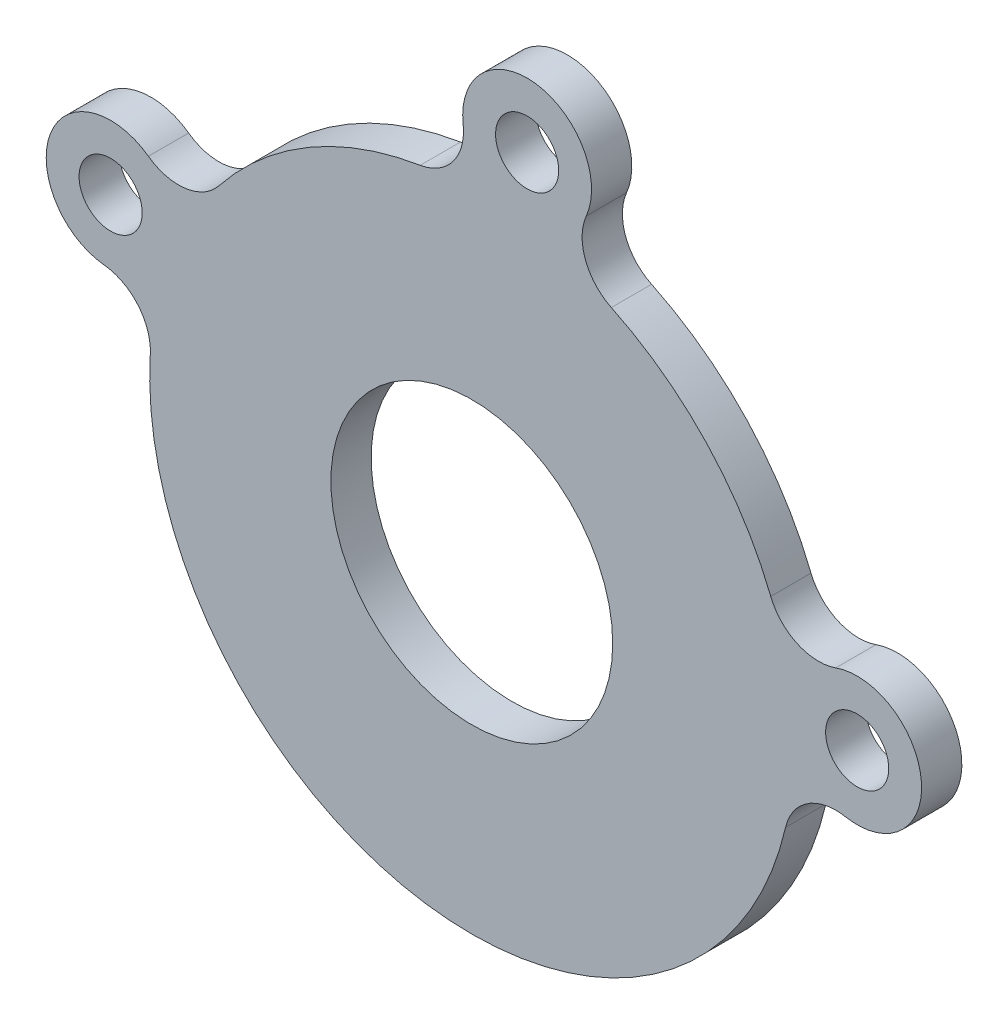
ISO-10303-21;
HEADER;
FILE_DESCRIPTION(('STEP AP214'),'2;1');
FILE_NAME('part.step','',(''),(''),'','','');
FILE_SCHEMA(('AUTOMOTIVE_DESIGN { 1 0 10303 214 1 1 1 1 }'));
ENDSEC;
DATA;
#1=APPLICATION_CONTEXT('core data for automotive mechanical design processes');
#2=APPLICATION_PROTOCOL_DEFINITION('international standard','automotive_design',2000,#1);
#3=PRODUCT_CONTEXT('',#1,'mechanical');
#4=PRODUCT('Part','Part','',(#3));
#5=PRODUCT_RELATED_PRODUCT_CATEGORY('part','',(#4));
#6=PRODUCT_DEFINITION_FORMATION('','',#4);
#7=PRODUCT_DEFINITION_CONTEXT('part definition',#1,'design');
#8=PRODUCT_DEFINITION('design','',#6,#7);
#9=PRODUCT_DEFINITION_SHAPE('','',#8);
#10=(LENGTH_UNIT() NAMED_UNIT(*) SI_UNIT(.MILLI.,.METRE.));
#11=(NAMED_UNIT(*) PLANE_ANGLE_UNIT() SI_UNIT($,.RADIAN.));
#12=(NAMED_UNIT(*) SI_UNIT($,.STERADIAN.) SOLID_ANGLE_UNIT());
#13=UNCERTAINTY_MEASURE_WITH_UNIT(LENGTH_MEASURE(1.E-05),#10,'distance_accuracy_value','');
#14=(GEOMETRIC_REPRESENTATION_CONTEXT(3) GLOBAL_UNCERTAINTY_ASSIGNED_CONTEXT((#13)) GLOBAL_UNIT_ASSIGNED_CONTEXT((#10,
#11,#12)) REPRESENTATION_CONTEXT('',''));
#15=CARTESIAN_POINT('',(0.,0.,0.));
#16=DIRECTION('',(0.,0.,1.));
#17=DIRECTION('',(1.,0.,0.));
#18=AXIS2_PLACEMENT_3D('',#15,#16,#17);
#19=CARTESIAN_POINT('',(245.745886312281,216.215828919142,3.175));
#20=DIRECTION('',(0.,0.,-1.));
#21=DIRECTION('',(-1.,0.,0.));
#22=AXIS2_PLACEMENT_3D('',#19,#20,#21);
#23=CYLINDRICAL_SURFACE('',#22,25.4);
#24=CARTESIAN_POINT('',(245.745886312281,216.215828919142,0.));
#25=DIRECTION('',(0.,0.,1.));
#26=DIRECTION('',(1.,0.,0.));
#27=AXIS2_PLACEMENT_3D('',#24,#25,#26);
#28=CIRCLE('',#27,25.4);
#29=CARTESIAN_POINT('',(269.321400878239,225.668612263232,0.));
#30=VERTEX_POINT('',#29);
#31=CARTESIAN_POINT('',(256.74888847989,239.108927077749,0.));
#32=VERTEX_POINT('',#31);
#33=EDGE_CURVE('E175',#30,#32,#28,.T.);
#34=ORIENTED_EDGE('',*,*,#33,.T.);
#35=DIRECTION('',(0.,0.,-1.));
#36=VECTOR('',#35,1.);
#37=CARTESIAN_POINT('',(256.74888847989,239.108927077749,3.175));
#38=LINE('',#37,#36);
#39=CARTESIAN_POINT('',(256.74888847989,239.108927077749,3.175));
#40=VERTEX_POINT('',#39);
#41=EDGE_CURVE('E11',#40,#32,#38,.T.);
#42=ORIENTED_EDGE('',*,*,#41,.F.);
#43=CARTESIAN_POINT('',(245.745886312281,216.215828919142,3.175));
#44=DIRECTION('',(0.,0.,1.));
#45=DIRECTION('',(1.,0.,0.));
#46=AXIS2_PLACEMENT_3D('',#43,#44,#45);
#47=CIRCLE('',#46,25.4);
#48=CARTESIAN_POINT('',(269.321400878239,225.668612263232,3.175));
#49=VERTEX_POINT('',#48);
#50=EDGE_CURVE('E157',#49,#40,#47,.T.);
#51=ORIENTED_EDGE('',*,*,#50,.F.);
#52=DIRECTION('',(0.,0.,-1.));
#53=VECTOR('',#52,1.);
#54=CARTESIAN_POINT('',(269.321400878239,225.668612263232,3.175));
#55=LINE('',#54,#53);
#56=EDGE_CURVE('E171',#49,#30,#55,.T.);
#57=ORIENTED_EDGE('',*,*,#56,.T.);
#58=EDGE_LOOP('',(#34,#42,#51,#57));
#59=FACE_BOUND('',#58,.T.);
#60=ADVANCED_FACE('F37',(#59),#23,.T.);
#61=CARTESIAN_POINT('',(258.509368826707,242.771822783126,3.175));
#62=DIRECTION('',(0.,0.,-1.));
#63=DIRECTION('',(-1.,0.,0.));
#64=AXIS2_PLACEMENT_3D('',#61,#62,#63);
#65=CYLINDRICAL_SURFACE('',#64,4.06400000000001);
#66=CARTESIAN_POINT('',(258.509368826707,242.771822783126,0.));
#67=DIRECTION('',(0.,0.,1.));
#68=DIRECTION('',(1.,0.,0.));
#69=AXIS2_PLACEMENT_3D('',#66,#67,#68);
#70=CIRCLE('',#69,4.06400000000001);
#71=CARTESIAN_POINT('',(254.775531188719,244.376363992674,0.));
#72=VERTEX_POINT('',#71);
#73=EDGE_CURVE('E178',#32,#72,#70,.F.);
#74=ORIENTED_EDGE('',*,*,#73,.T.);
#75=DIRECTION('',(0.,0.,-1.));
#76=VECTOR('',#75,1.);
#77=CARTESIAN_POINT('',(254.775531188719,244.376363992674,3.175));
#78=LINE('',#77,#76);
#79=CARTESIAN_POINT('',(254.775531188719,244.376363992674,3.175));
#80=VERTEX_POINT('',#79);
#81=EDGE_CURVE('E46',#80,#72,#78,.T.);
#82=ORIENTED_EDGE('',*,*,#81,.F.);
#83=CARTESIAN_POINT('',(258.509368826707,242.771822783126,3.175));
#84=DIRECTION('',(0.,0.,1.));
#85=DIRECTION('',(1.,0.,0.));
#86=AXIS2_PLACEMENT_3D('',#83,#84,#85);
#87=CIRCLE('',#86,4.06400000000001);
#88=EDGE_CURVE('E108',#40,#80,#87,.F.);
#89=ORIENTED_EDGE('',*,*,#88,.F.);
#90=ORIENTED_EDGE('',*,*,#41,.T.);
#91=EDGE_LOOP('',(#74,#82,#89,#90));
#92=FACE_BOUND('',#91,.T.);
#93=ADVANCED_FACE('F274',(#92),#65,.F.);
#94=CARTESIAN_POINT('',(250.108234141233,246.38204050461,3.175));
#95=DIRECTION('',(0.,0.,-1.));
#96=DIRECTION('',(-1.,0.,0.));
#97=AXIS2_PLACEMENT_3D('',#94,#95,#96);
#98=CYLINDRICAL_SURFACE('',#97,5.07999999999996);
#99=CARTESIAN_POINT('',(250.108234141233,246.38204050461,0.));
#100=DIRECTION('',(0.,0.,1.));
#101=DIRECTION('',(1.,0.,0.));
#102=AXIS2_PLACEMENT_3D('',#99,#100,#101);
#103=CIRCLE('',#102,5.07999999999996);
#104=CARTESIAN_POINT('',(245.063944071492,245.780760459777,0.));
#105=VERTEX_POINT('',#104);
#106=EDGE_CURVE('E182',#72,#105,#103,.T.);
#107=ORIENTED_EDGE('',*,*,#106,.T.);
#108=DIRECTION('',(0.,0.,-1.));
#109=VECTOR('',#108,1.);
#110=CARTESIAN_POINT('',(245.063944071492,245.780760459777,3.175));
#111=LINE('',#110,#109);
#112=CARTESIAN_POINT('',(245.063944071492,245.780760459777,3.175));
#113=VERTEX_POINT('',#112);
#114=EDGE_CURVE('E222',#113,#105,#111,.T.);
#115=ORIENTED_EDGE('',*,*,#114,.F.);
#116=CARTESIAN_POINT('',(250.108234141233,246.38204050461,3.175));
#117=DIRECTION('',(0.,0.,1.));
#118=DIRECTION('',(1.,0.,0.));
#119=AXIS2_PLACEMENT_3D('',#116,#117,#118);
#120=CIRCLE('',#119,5.07999999999996);
#121=EDGE_CURVE('E230',#80,#113,#120,.T.);
#122=ORIENTED_EDGE('',*,*,#121,.F.);
#123=ORIENTED_EDGE('',*,*,#81,.T.);
#124=EDGE_LOOP('',(#107,#115,#122,#123));
#125=FACE_BOUND('',#124,.T.);
#126=ADVANCED_FACE('F228',(#125),#98,.T.);
#127=CARTESIAN_POINT('',(241.0285120157,245.299736423911,3.175));
#128=DIRECTION('',(0.,0.,-1.));
#129=DIRECTION('',(-1.,0.,0.));
#130=AXIS2_PLACEMENT_3D('',#127,#128,#129);
#131=CYLINDRICAL_SURFACE('',#130,4.06399999999998);
#132=CARTESIAN_POINT('',(241.0285120157,245.299736423911,0.));
#133=DIRECTION('',(0.,0.,1.));
#134=DIRECTION('',(1.,0.,0.));
#135=AXIS2_PLACEMENT_3D('',#132,#133,#134);
#136=CIRCLE('',#135,4.06399999999998);
#137=CARTESIAN_POINT('',(241.67918433247,241.288162974977,0.));
#138=VERTEX_POINT('',#137);
#139=EDGE_CURVE('E184',#105,#138,#136,.F.);
#140=ORIENTED_EDGE('',*,*,#139,.T.);
#141=DIRECTION('',(0.,0.,-1.));
#142=VECTOR('',#141,1.);
#143=CARTESIAN_POINT('',(241.67918433247,241.288162974977,3.175));
#144=LINE('',#143,#142);
#145=CARTESIAN_POINT('',(241.67918433247,241.288162974977,3.175));
#146=VERTEX_POINT('',#145);
#147=EDGE_CURVE('E219',#146,#138,#144,.T.);
#148=ORIENTED_EDGE('',*,*,#147,.F.);
#149=CARTESIAN_POINT('',(241.0285120157,245.299736423911,3.175));
#150=DIRECTION('',(0.,0.,1.));
#151=DIRECTION('',(1.,0.,0.));
#152=AXIS2_PLACEMENT_3D('',#149,#150,#151);
#153=CIRCLE('',#152,4.06399999999998);
#154=EDGE_CURVE('E249',#113,#146,#153,.F.);
#155=ORIENTED_EDGE('',*,*,#154,.F.);
#156=ORIENTED_EDGE('',*,*,#114,.T.);
#157=EDGE_LOOP('',(#140,#148,#155,#156));
#158=FACE_BOUND('',#157,.T.);
#159=ADVANCED_FACE('F240',(#158),#131,.F.);
#160=CARTESIAN_POINT('',(225.81414425869,231.960213909008,0.));
#161=VERTEX_POINT('',#160);
#162=EDGE_CURVE('E180',#138,#161,#28,.T.);
#163=ORIENTED_EDGE('',*,*,#162,.T.);
#164=DIRECTION('',(0.,0.,-1.));
#165=VECTOR('',#164,1.);
#166=CARTESIAN_POINT('',(225.81414425869,231.960213909008,3.175));
#167=LINE('',#166,#165);
#168=CARTESIAN_POINT('',(225.81414425869,231.960213909008,3.175));
#169=VERTEX_POINT('',#168);
#170=EDGE_CURVE('E217',#169,#161,#167,.T.);
#171=ORIENTED_EDGE('',*,*,#170,.F.);
#172=EDGE_CURVE('E156',#146,#169,#47,.T.);
#173=ORIENTED_EDGE('',*,*,#172,.F.);
#174=ORIENTED_EDGE('',*,*,#147,.T.);
#175=EDGE_LOOP('',(#163,#171,#173,#174));
#176=FACE_BOUND('',#175,.T.);
#177=ADVANCED_FACE('F244',(#176),#23,.T.);
#178=CARTESIAN_POINT('',(222.625065530115,234.479315507386,3.175));
#179=DIRECTION('',(0.,0.,-1.));
#180=DIRECTION('',(-1.,0.,0.));
#181=AXIS2_PLACEMENT_3D('',#178,#179,#180);
#182=CYLINDRICAL_SURFACE('',#181,4.06399999999999);
#183=CARTESIAN_POINT('',(222.625065530115,234.479315507386,0.));
#184=DIRECTION('',(0.,0.,1.));
#185=DIRECTION('',(1.,0.,0.));
#186=AXIS2_PLACEMENT_3D('',#183,#184,#185);
#187=CIRCLE('',#186,4.06399999999999);
#188=CARTESIAN_POINT('',(220.242607821496,231.18690130704,0.));
#189=VERTEX_POINT('',#188);
#190=EDGE_CURVE('E186',#189,#161,#187,.T.);
#191=ORIENTED_EDGE('',*,*,#190,.F.);
#192=DIRECTION('',(0.,0.,-1.));
#193=VECTOR('',#192,1.);
#194=CARTESIAN_POINT('',(220.242607821496,231.18690130704,3.175));
#195=LINE('',#194,#193);
#196=CARTESIAN_POINT('',(220.242607821496,231.18690130704,3.175));
#197=VERTEX_POINT('',#196);
#198=EDGE_CURVE('E215',#197,#189,#195,.T.);
#199=ORIENTED_EDGE('',*,*,#198,.F.);
#200=CARTESIAN_POINT('',(222.625065530115,234.479315507386,3.175));
#201=DIRECTION('',(0.,0.,1.));
#202=DIRECTION('',(1.,0.,0.));
#203=AXIS2_PLACEMENT_3D('',#200,#201,#202);
#204=CIRCLE('',#203,4.06399999999999);
#205=EDGE_CURVE('E248',#197,#169,#204,.T.);
#206=ORIENTED_EDGE('',*,*,#205,.T.);
#207=ORIENTED_EDGE('',*,*,#170,.T.);
#208=EDGE_LOOP('',(#191,#199,#206,#207));
#209=FACE_BOUND('',#208,.T.);
#210=ADVANCED_FACE('F284',(#209),#182,.F.);
#211=CARTESIAN_POINT('',(217.264535685722,227.071383556608,3.175));
#212=DIRECTION('',(0.,0.,-1.));
#213=DIRECTION('',(-1.,0.,0.));
#214=AXIS2_PLACEMENT_3D('',#211,#212,#213);
#215=CYLINDRICAL_SURFACE('',#214,5.07999999999994);
#216=CARTESIAN_POINT('',(217.264535685722,227.071383556608,0.));
#217=DIRECTION('',(0.,0.,1.));
#218=DIRECTION('',(1.,0.,0.));
#219=AXIS2_PLACEMENT_3D('',#216,#217,#218);
#220=CIRCLE('',#219,5.07999999999994);
#221=CARTESIAN_POINT('',(216.747814838663,222.017731454789,0.));
#222=VERTEX_POINT('',#221);
#223=EDGE_CURVE('E189',#189,#222,#220,.T.);
#224=ORIENTED_EDGE('',*,*,#223,.T.);
#225=DIRECTION('',(0.,0.,-1.));
#226=VECTOR('',#225,1.);
#227=CARTESIAN_POINT('',(216.747814838663,222.017731454789,3.175));
#228=LINE('',#227,#226);
#229=CARTESIAN_POINT('',(216.747814838663,222.017731454789,3.175));
#230=VERTEX_POINT('',#229);
#231=EDGE_CURVE('E212',#230,#222,#228,.T.);
#232=ORIENTED_EDGE('',*,*,#231,.F.);
#233=CARTESIAN_POINT('',(217.264535685722,227.071383556608,3.175));
#234=DIRECTION('',(0.,0.,1.));
#235=DIRECTION('',(1.,0.,0.));
#236=AXIS2_PLACEMENT_3D('',#233,#234,#235);
#237=CIRCLE('',#236,5.07999999999994);
#238=EDGE_CURVE('E250',#197,#230,#237,.T.);
#239=ORIENTED_EDGE('',*,*,#238,.F.);
#240=ORIENTED_EDGE('',*,*,#198,.T.);
#241=EDGE_LOOP('',(#224,#232,#239,#240));
#242=FACE_BOUND('',#241,.T.);
#243=ADVANCED_FACE('F292',(#242),#215,.T.);
#244=CARTESIAN_POINT('',(216.334438161015,217.974809773334,3.175));
#245=DIRECTION('',(0.,0.,-1.));
#246=DIRECTION('',(-1.,0.,0.));
#247=AXIS2_PLACEMENT_3D('',#244,#245,#246);
#248=CYLINDRICAL_SURFACE('',#247,4.064);
#249=CARTESIAN_POINT('',(216.334438161015,217.974809773334,0.));
#250=DIRECTION('',(0.,0.,1.));
#251=DIRECTION('',(1.,0.,0.));
#252=AXIS2_PLACEMENT_3D('',#249,#250,#251);
#253=CIRCLE('',#252,4.064);
#254=CARTESIAN_POINT('',(220.391189630156,217.73219172448,0.));
#255=VERTEX_POINT('',#254);
#256=EDGE_CURVE('E191',#222,#255,#253,.F.);
#257=ORIENTED_EDGE('',*,*,#256,.T.);
#258=DIRECTION('',(0.,0.,-1.));
#259=VECTOR('',#258,1.);
#260=CARTESIAN_POINT('',(220.391189630156,217.73219172448,3.175));
#261=LINE('',#260,#259);
#262=CARTESIAN_POINT('',(220.391189630156,217.73219172448,3.175));
#263=VERTEX_POINT('',#262);
#264=EDGE_CURVE('E209',#263,#255,#261,.T.);
#265=ORIENTED_EDGE('',*,*,#264,.F.);
#266=CARTESIAN_POINT('',(216.334438161015,217.974809773334,3.175));
#267=DIRECTION('',(0.,0.,1.));
#268=DIRECTION('',(1.,0.,0.));
#269=AXIS2_PLACEMENT_3D('',#266,#267,#268);
#270=CIRCLE('',#269,4.064);
#271=EDGE_CURVE('E154',#230,#263,#270,.F.);
#272=ORIENTED_EDGE('',*,*,#271,.F.);
#273=ORIENTED_EDGE('',*,*,#231,.T.);
#274=EDGE_LOOP('',(#257,#265,#272,#273));
#275=FACE_BOUND('',#274,.T.);
#276=ADVANCED_FACE('F286',(#275),#248,.F.);
#277=CARTESIAN_POINT('',(270.491441814201,210.487174373667,0.));
#278=VERTEX_POINT('',#277);
#279=EDGE_CURVE('E179',#255,#278,#28,.T.);
#280=ORIENTED_EDGE('',*,*,#279,.T.);
#281=DIRECTION('',(0.,0.,-1.));
#282=VECTOR('',#281,1.);
#283=CARTESIAN_POINT('',(270.491441814201,210.487174373667,3.175));
#284=LINE('',#283,#282);
#285=CARTESIAN_POINT('',(270.491441814201,210.487174373667,3.175));
#286=VERTEX_POINT('',#285);
#287=EDGE_CURVE('E142',#286,#278,#284,.T.);
#288=ORIENTED_EDGE('',*,*,#287,.F.);
#289=EDGE_CURVE('E151',#263,#286,#47,.T.);
#290=ORIENTED_EDGE('',*,*,#289,.F.);
#291=ORIENTED_EDGE('',*,*,#264,.T.);
#292=EDGE_LOOP('',(#280,#288,#290,#291));
#293=FACE_BOUND('',#292,.T.);
#294=ADVANCED_FACE('F277',(#293),#23,.T.);
#295=CARTESIAN_POINT('',(274.450730694508,209.570589646391,3.175));
#296=DIRECTION('',(0.,0.,-1.));
#297=DIRECTION('',(-1.,0.,0.));
#298=AXIS2_PLACEMENT_3D('',#295,#296,#297);
#299=CYLINDRICAL_SURFACE('',#298,4.06400000000001);
#300=CARTESIAN_POINT('',(274.450730694508,209.570589646391,0.));
#301=DIRECTION('',(0.,0.,1.));
#302=DIRECTION('',(1.,0.,0.));
#303=AXIS2_PLACEMENT_3D('',#300,#301,#302);
#304=CIRCLE('',#303,4.06400000000001);
#305=CARTESIAN_POINT('',(275.199634436508,213.564990625914,0.));
#306=VERTEX_POINT('',#305);
#307=EDGE_CURVE('E141',#306,#278,#304,.T.);
#308=ORIENTED_EDGE('',*,*,#307,.F.);
#309=DIRECTION('',(0.,0.,-1.));
#310=VECTOR('',#309,1.);
#311=CARTESIAN_POINT('',(275.199634436508,213.564990625914,3.175));
#312=LINE('',#311,#310);
#313=CARTESIAN_POINT('',(275.199634436508,213.564990625914,3.175));
#314=VERTEX_POINT('',#313);
#315=EDGE_CURVE('E135',#314,#306,#312,.T.);
#316=ORIENTED_EDGE('',*,*,#315,.F.);
#317=CARTESIAN_POINT('',(274.450730694508,209.570589646391,3.175));
#318=DIRECTION('',(0.,0.,1.));
#319=DIRECTION('',(1.,0.,0.));
#320=AXIS2_PLACEMENT_3D('',#317,#318,#319);
#321=CIRCLE('',#320,4.06400000000001);
#322=EDGE_CURVE('E139',#314,#286,#321,.T.);
#323=ORIENTED_EDGE('',*,*,#322,.T.);
#324=ORIENTED_EDGE('',*,*,#287,.T.);
#325=EDGE_LOOP('',(#308,#316,#323,#324));
#326=FACE_BOUND('',#325,.T.);
#327=ADVANCED_FACE('F137',(#326),#299,.F.);
#328=CARTESIAN_POINT('',(276.135764114007,218.557991850319,3.175));
#329=DIRECTION('',(0.,0.,-1.));
#330=DIRECTION('',(-1.,0.,0.));
#331=AXIS2_PLACEMENT_3D('',#328,#329,#330);
#332=CYLINDRICAL_SURFACE('',#331,5.07999999999996);
#333=CARTESIAN_POINT('',(276.135764114007,218.557991850319,0.));
#334=DIRECTION('',(0.,0.,1.));
#335=DIRECTION('',(1.,0.,0.));
#336=AXIS2_PLACEMENT_3D('',#333,#334,#335);
#337=CIRCLE('',#336,5.07999999999996);
#338=CARTESIAN_POINT('',(274.445608055554,223.348583932523,0.));
#339=VERTEX_POINT('',#338);
#340=EDGE_CURVE('E94',#306,#339,#337,.T.);
#341=ORIENTED_EDGE('',*,*,#340,.T.);
#342=DIRECTION('',(0.,0.,-1.));
#343=VECTOR('',#342,1.);
#344=CARTESIAN_POINT('',(274.445608055554,223.348583932523,3.175));
#345=LINE('',#344,#343);
#346=CARTESIAN_POINT('',(274.445608055554,223.348583932523,3.175));
#347=VERTEX_POINT('',#346);
#348=EDGE_CURVE('E143',#347,#339,#345,.T.);
#349=ORIENTED_EDGE('',*,*,#348,.F.);
#350=CARTESIAN_POINT('',(276.135764114007,218.557991850319,3.175));
#351=DIRECTION('',(0.,0.,1.));
#352=DIRECTION('',(1.,0.,0.));
#353=AXIS2_PLACEMENT_3D('',#350,#351,#352);
#354=CIRCLE('',#353,5.07999999999996);
#355=EDGE_CURVE('E145',#314,#347,#354,.T.);
#356=ORIENTED_EDGE('',*,*,#355,.F.);
#357=ORIENTED_EDGE('',*,*,#315,.T.);
#358=EDGE_LOOP('',(#341,#349,#356,#357));
#359=FACE_BOUND('',#358,.T.);
#360=ADVANCED_FACE('F146',(#359),#332,.T.);
#361=CARTESIAN_POINT('',(250.108234141233,246.38204050461,3.175));
#362=DIRECTION('',(0.,0.,-1.));
#363=DIRECTION('',(-1.,0.,0.));
#364=AXIS2_PLACEMENT_3D('',#361,#362,#363);
#365=CYLINDRICAL_SURFACE('',#364,2.48920000000001);
#366=CARTESIAN_POINT('',(250.108234141233,246.38204050461,3.175));
#367=DIRECTION('',(0.,0.,1.));
#368=DIRECTION('',(1.,0.,0.));
#369=AXIS2_PLACEMENT_3D('',#366,#367,#368);
#370=CIRCLE('',#369,2.48920000000001);
#371=CARTESIAN_POINT('',(252.597434141233,246.38204050461,3.175));
#372=VERTEX_POINT('',#371);
#373=EDGE_CURVE('E165',#372,#372,#370,.T.);
#374=ORIENTED_EDGE('',*,*,#373,.T.);
#375=EDGE_LOOP('',(#374));
#376=FACE_BOUND('',#375,.T.);
#377=CARTESIAN_POINT('',(250.108234141233,246.38204050461,0.));
#378=DIRECTION('',(0.,0.,1.));
#379=DIRECTION('',(1.,0.,0.));
#380=AXIS2_PLACEMENT_3D('',#377,#378,#379);
#381=CIRCLE('',#380,2.48920000000001);
#382=CARTESIAN_POINT('',(252.597434141233,246.38204050461,0.));
#383=VERTEX_POINT('',#382);
#384=EDGE_CURVE('E199',#383,#383,#381,.T.);
#385=ORIENTED_EDGE('',*,*,#384,.F.);
#386=EDGE_LOOP('',(#385));
#387=FACE_BOUND('',#386,.T.);
#388=ADVANCED_FACE('F306',(#376,#387),#365,.F.);
#389=CARTESIAN_POINT('',(276.135764114007,218.557991850319,3.175));
#390=DIRECTION('',(0.,0.,-1.));
#391=DIRECTION('',(-1.,0.,0.));
#392=AXIS2_PLACEMENT_3D('',#389,#390,#391);
#393=CYLINDRICAL_SURFACE('',#392,2.48920000000001);
#394=CARTESIAN_POINT('',(276.135764114007,218.557991850319,3.175));
#395=DIRECTION('',(0.,0.,1.));
#396=DIRECTION('',(1.,0.,0.));
#397=AXIS2_PLACEMENT_3D('',#394,#395,#396);
#398=CIRCLE('',#397,2.48920000000001);
#399=CARTESIAN_POINT('',(278.624964114007,218.557991850319,3.175));
#400=VERTEX_POINT('',#399);
#401=EDGE_CURVE('E162',#400,#400,#398,.T.);
#402=ORIENTED_EDGE('',*,*,#401,.T.);
#403=EDGE_LOOP('',(#402));
#404=FACE_BOUND('',#403,.T.);
#405=CARTESIAN_POINT('',(276.135764114007,218.557991850319,0.));
#406=DIRECTION('',(0.,0.,1.));
#407=DIRECTION('',(1.,0.,0.));
#408=AXIS2_PLACEMENT_3D('',#405,#406,#407);
#409=CIRCLE('',#408,2.48920000000001);
#410=CARTESIAN_POINT('',(278.624964114007,218.557991850319,0.));
#411=VERTEX_POINT('',#410);
#412=EDGE_CURVE('E196',#411,#411,#409,.T.);
#413=ORIENTED_EDGE('',*,*,#412,.F.);
#414=EDGE_LOOP('',(#413));
#415=FACE_BOUND('',#414,.T.);
#416=ADVANCED_FACE('F300',(#404,#415),#393,.F.);
#417=CARTESIAN_POINT('',(273.093483208792,227.181057598286,3.175));
#418=DIRECTION('',(0.,0.,-1.));
#419=DIRECTION('',(-1.,0.,0.));
#420=AXIS2_PLACEMENT_3D('',#417,#418,#419);
#421=CYLINDRICAL_SURFACE('',#420,4.06399999999997);
#422=CARTESIAN_POINT('',(273.093483208792,227.181057598286,0.));
#423=DIRECTION('',(0.,0.,1.));
#424=DIRECTION('',(1.,0.,0.));
#425=AXIS2_PLACEMENT_3D('',#422,#423,#424);
#426=CIRCLE('',#425,4.06399999999997);
#427=EDGE_CURVE('E100',#339,#30,#426,.F.);
#428=ORIENTED_EDGE('',*,*,#427,.T.);
#429=ORIENTED_EDGE('',*,*,#56,.F.);
#430=CARTESIAN_POINT('',(273.093483208792,227.181057598286,3.175));
#431=DIRECTION('',(0.,0.,1.));
#432=DIRECTION('',(1.,0.,0.));
#433=AXIS2_PLACEMENT_3D('',#430,#431,#432);
#434=CIRCLE('',#433,4.06399999999997);
#435=EDGE_CURVE('E54',#347,#49,#434,.F.);
#436=ORIENTED_EDGE('',*,*,#435,.F.);
#437=ORIENTED_EDGE('',*,*,#348,.T.);
#438=EDGE_LOOP('',(#428,#429,#436,#437));
#439=FACE_BOUND('',#438,.T.);
#440=ADVANCED_FACE('F298',(#439),#421,.F.);
#441=CARTESIAN_POINT('',(245.745886312281,216.215828919142,3.175));
#442=DIRECTION('',(0.,0.,-1.));
#443=DIRECTION('',(-1.,0.,0.));
#444=AXIS2_PLACEMENT_3D('',#441,#442,#443);
#445=CYLINDRICAL_SURFACE('',#444,11.1125000000005);
#446=CARTESIAN_POINT('',(245.745886312281,216.215828919142,3.175));
#447=DIRECTION('',(0.,0.,1.));
#448=DIRECTION('',(1.,0.,0.));
#449=AXIS2_PLACEMENT_3D('',#446,#447,#448);
#450=CIRCLE('',#449,11.1125000000005);
#451=CARTESIAN_POINT('',(256.858386312282,216.215828919142,3.175));
#452=VERTEX_POINT('',#451);
#453=EDGE_CURVE('E205',#452,#452,#450,.T.);
#454=ORIENTED_EDGE('',*,*,#453,.T.);
#455=EDGE_LOOP('',(#454));
#456=FACE_BOUND('',#455,.T.);
#457=CARTESIAN_POINT('',(245.745886312281,216.215828919142,0.));
#458=DIRECTION('',(0.,0.,1.));
#459=DIRECTION('',(1.,0.,0.));
#460=AXIS2_PLACEMENT_3D('',#457,#458,#459);
#461=CIRCLE('',#460,11.1125000000005);
#462=CARTESIAN_POINT('',(256.858386312282,216.215828919142,0.));
#463=VERTEX_POINT('',#462);
#464=EDGE_CURVE('E172',#463,#463,#461,.T.);
#465=ORIENTED_EDGE('',*,*,#464,.F.);
#466=EDGE_LOOP('',(#465));
#467=FACE_BOUND('',#466,.T.);
#468=ADVANCED_FACE('F39',(#456,#467),#445,.F.);
#469=CARTESIAN_POINT('',(217.264535685722,227.071383556608,3.175));
#470=DIRECTION('',(0.,0.,-1.));
#471=DIRECTION('',(-1.,0.,0.));
#472=AXIS2_PLACEMENT_3D('',#469,#470,#471);
#473=CYLINDRICAL_SURFACE('',#472,2.48920000000001);
#474=CARTESIAN_POINT('',(217.264535685722,227.071383556608,3.175));
#475=DIRECTION('',(0.,0.,1.));
#476=DIRECTION('',(1.,0.,0.));
#477=AXIS2_PLACEMENT_3D('',#474,#475,#476);
#478=CIRCLE('',#477,2.48920000000001);
#479=CARTESIAN_POINT('',(219.753735685722,227.071383556608,3.175));
#480=VERTEX_POINT('',#479);
#481=EDGE_CURVE('E168',#480,#480,#478,.T.);
#482=ORIENTED_EDGE('',*,*,#481,.T.);
#483=EDGE_LOOP('',(#482));
#484=FACE_BOUND('',#483,.T.);
#485=CARTESIAN_POINT('',(217.264535685722,227.071383556608,0.));
#486=DIRECTION('',(0.,0.,1.));
#487=DIRECTION('',(1.,0.,0.));
#488=AXIS2_PLACEMENT_3D('',#485,#486,#487);
#489=CIRCLE('',#488,2.48920000000001);
#490=CARTESIAN_POINT('',(219.753735685722,227.071383556608,0.));
#491=VERTEX_POINT('',#490);
#492=EDGE_CURVE('E202',#491,#491,#489,.T.);
#493=ORIENTED_EDGE('',*,*,#492,.F.);
#494=EDGE_LOOP('',(#493));
#495=FACE_BOUND('',#494,.T.);
#496=ADVANCED_FACE('F263',(#484,#495),#473,.F.);
#497=CARTESIAN_POINT('',(0.,0.,3.175));
#498=DIRECTION('',(0.,0.,1.));
#499=DIRECTION('',(1.,0.,0.));
#500=AXIS2_PLACEMENT_3D('',#497,#498,#499);
#501=PLANE('',#500);
#502=ORIENTED_EDGE('',*,*,#453,.F.);
#503=EDGE_LOOP('',(#502));
#504=FACE_BOUND('',#503,.T.);
#505=ORIENTED_EDGE('',*,*,#50,.T.);
#506=ORIENTED_EDGE('',*,*,#88,.T.);
#507=ORIENTED_EDGE('',*,*,#121,.T.);
#508=ORIENTED_EDGE('',*,*,#154,.T.);
#509=ORIENTED_EDGE('',*,*,#172,.T.);
#510=ORIENTED_EDGE('',*,*,#205,.F.);
#511=ORIENTED_EDGE('',*,*,#238,.T.);
#512=ORIENTED_EDGE('',*,*,#271,.T.);
#513=ORIENTED_EDGE('',*,*,#289,.T.);
#514=ORIENTED_EDGE('',*,*,#322,.F.);
#515=ORIENTED_EDGE('',*,*,#355,.T.);
#516=ORIENTED_EDGE('',*,*,#435,.T.);
#517=EDGE_LOOP('',(#505,#506,#507,#508,#509,#510,#511,#512,#513,#514,#515,#516));
#518=FACE_BOUND('',#517,.T.);
#519=ORIENTED_EDGE('',*,*,#401,.F.);
#520=EDGE_LOOP('',(#519));
#521=FACE_BOUND('',#520,.T.);
#522=ORIENTED_EDGE('',*,*,#373,.F.);
#523=EDGE_LOOP('',(#522));
#524=FACE_BOUND('',#523,.T.);
#525=ORIENTED_EDGE('',*,*,#481,.F.);
#526=EDGE_LOOP('',(#525));
#527=FACE_BOUND('',#526,.T.);
#528=ADVANCED_FACE('F148',(#504,#518,#521,#524,#527),#501,.T.);
#529=CARTESIAN_POINT('',(0.,0.,0.));
#530=DIRECTION('',(0.,0.,1.));
#531=DIRECTION('',(1.,0.,0.));
#532=AXIS2_PLACEMENT_3D('',#529,#530,#531);
#533=PLANE('',#532);
#534=ORIENTED_EDGE('',*,*,#464,.T.);
#535=EDGE_LOOP('',(#534));
#536=FACE_BOUND('',#535,.T.);
#537=ORIENTED_EDGE('',*,*,#33,.F.);
#538=ORIENTED_EDGE('',*,*,#427,.F.);
#539=ORIENTED_EDGE('',*,*,#340,.F.);
#540=ORIENTED_EDGE('',*,*,#307,.T.);
#541=ORIENTED_EDGE('',*,*,#279,.F.);
#542=ORIENTED_EDGE('',*,*,#256,.F.);
#543=ORIENTED_EDGE('',*,*,#223,.F.);
#544=ORIENTED_EDGE('',*,*,#190,.T.);
#545=ORIENTED_EDGE('',*,*,#162,.F.);
#546=ORIENTED_EDGE('',*,*,#139,.F.);
#547=ORIENTED_EDGE('',*,*,#106,.F.);
#548=ORIENTED_EDGE('',*,*,#73,.F.);
#549=EDGE_LOOP('',(#537,#538,#539,#540,#541,#542,#543,#544,#545,#546,#547,#548));
#550=FACE_BOUND('',#549,.T.);
#551=ORIENTED_EDGE('',*,*,#412,.T.);
#552=EDGE_LOOP('',(#551));
#553=FACE_BOUND('',#552,.T.);
#554=ORIENTED_EDGE('',*,*,#384,.T.);
#555=EDGE_LOOP('',(#554));
#556=FACE_BOUND('',#555,.T.);
#557=ORIENTED_EDGE('',*,*,#492,.T.);
#558=EDGE_LOOP('',(#557));
#559=FACE_BOUND('',#558,.T.);
#560=ADVANCED_FACE('F234',(#536,#550,#553,#556,#559),#533,.F.);
#561=CLOSED_SHELL('',(#60,#93,#126,#159,#177,#210,#243,#276,#294,#327,#360,#388,#416,#440,#468,
#496,#528,#560));
#562=MANIFOLD_SOLID_BREP('B2',#561);
#563=ADVANCED_BREP_SHAPE_REPRESENTATION('',(#18,#562),#14);
#564=SHAPE_DEFINITION_REPRESENTATION(#9,#563);
ENDSEC;
END-ISO-10303-21;
